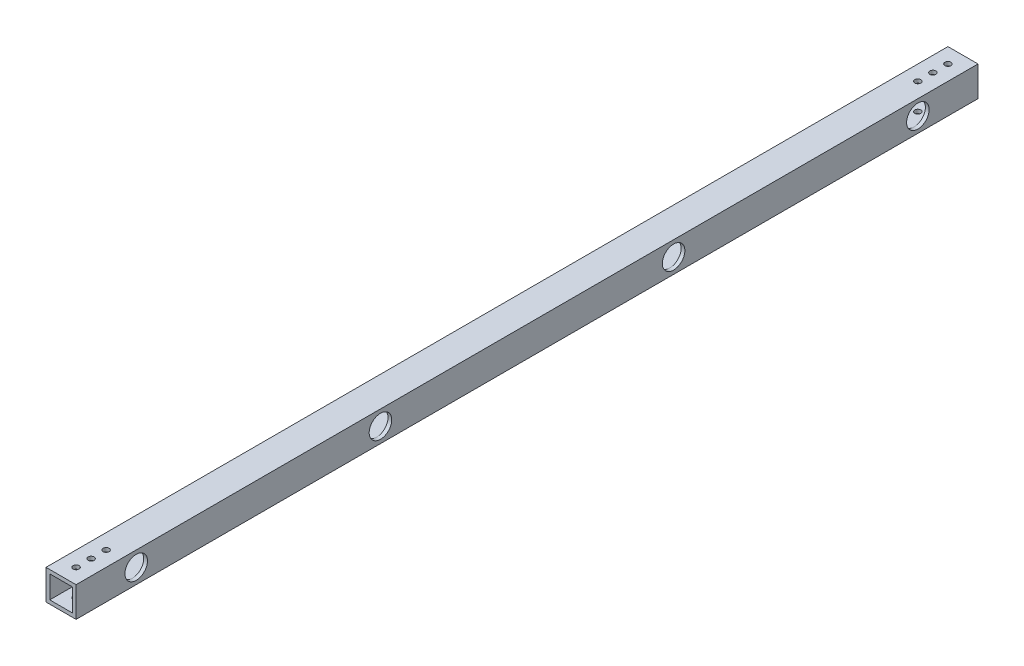
ISO-10303-21;
HEADER;
FILE_DESCRIPTION(('STEP AP214'),'2;1');
FILE_NAME('part.step','',(''),(''),'','','');
FILE_SCHEMA(('AUTOMOTIVE_DESIGN { 1 0 10303 214 1 1 1 1 }'));
ENDSEC;
DATA;
#1=APPLICATION_CONTEXT('core data for automotive mechanical design processes');
#2=APPLICATION_PROTOCOL_DEFINITION('international standard','automotive_design',2000,#1);
#3=PRODUCT_CONTEXT('',#1,'mechanical');
#4=PRODUCT('Part','Part','',(#3));
#5=PRODUCT_RELATED_PRODUCT_CATEGORY('part','',(#4));
#6=PRODUCT_DEFINITION_FORMATION('','',#4);
#7=PRODUCT_DEFINITION_CONTEXT('part definition',#1,'design');
#8=PRODUCT_DEFINITION('design','',#6,#7);
#9=PRODUCT_DEFINITION_SHAPE('','',#8);
#10=(LENGTH_UNIT() NAMED_UNIT(*) SI_UNIT(.MILLI.,.METRE.));
#11=(NAMED_UNIT(*) PLANE_ANGLE_UNIT() SI_UNIT($,.RADIAN.));
#12=(NAMED_UNIT(*) SI_UNIT($,.STERADIAN.) SOLID_ANGLE_UNIT());
#13=UNCERTAINTY_MEASURE_WITH_UNIT(LENGTH_MEASURE(1.E-05),#10,'distance_accuracy_value','');
#14=(GEOMETRIC_REPRESENTATION_CONTEXT(3) GLOBAL_UNCERTAINTY_ASSIGNED_CONTEXT((#13)) GLOBAL_UNIT_ASSIGNED_CONTEXT((#10,
#11,#12)) REPRESENTATION_CONTEXT('',''));
#15=CARTESIAN_POINT('',(0.,0.,0.));
#16=DIRECTION('',(0.,0.,1.));
#17=DIRECTION('',(1.,0.,0.));
#18=AXIS2_PLACEMENT_3D('',#15,#16,#17);
#19=CARTESIAN_POINT('',(-22.225,22.225,762.));
#20=DIRECTION('',(1.,0.,0.));
#21=DIRECTION('',(0.,1.,0.));
#22=AXIS2_PLACEMENT_3D('',#19,#20,#21);
#23=PLANE('',#22);
#24=CARTESIAN_POINT('',(-22.225,12.7,50.8));
#25=DIRECTION('',(1.,0.,0.));
#26=DIRECTION('',(0.,1.,0.));
#27=AXIS2_PLACEMENT_3D('',#24,#25,#26);
#28=CIRCLE('',#27,9.52500000000001);
#29=CARTESIAN_POINT('',(-22.225,22.225,50.8));
#30=VERTEX_POINT('',#29);
#31=CARTESIAN_POINT('',(-22.225,3.175,50.8));
#32=VERTEX_POINT('',#31);
#33=EDGE_CURVE('E53',#30,#32,#28,.T.);
#34=ORIENTED_EDGE('',*,*,#33,.F.);
#35=DIRECTION('',(0.,0.,-1.));
#36=VECTOR('',#35,1.);
#37=CARTESIAN_POINT('',(-22.225,22.225,762.));
#38=LINE('',#37,#36);
#39=CARTESIAN_POINT('',(-22.225,22.225,257.175));
#40=VERTEX_POINT('',#39);
#41=EDGE_CURVE('E170',#40,#30,#38,.T.);
#42=ORIENTED_EDGE('',*,*,#41,.F.);
#43=CARTESIAN_POINT('',(-22.225,12.7,257.175));
#44=DIRECTION('',(1.,0.,0.));
#45=DIRECTION('',(0.,1.,0.));
#46=AXIS2_PLACEMENT_3D('',#43,#44,#45);
#47=CIRCLE('',#46,9.52500000000002);
#48=CARTESIAN_POINT('',(-22.225,3.175,257.175));
#49=VERTEX_POINT('',#48);
#50=EDGE_CURVE('E149',#49,#40,#47,.T.);
#51=ORIENTED_EDGE('',*,*,#50,.F.);
#52=DIRECTION('',(0.,0.,-1.));
#53=VECTOR('',#52,1.);
#54=CARTESIAN_POINT('',(-22.225,3.175,762.));
#55=LINE('',#54,#53);
#56=EDGE_CURVE('E311',#49,#32,#55,.T.);
#57=ORIENTED_EDGE('',*,*,#56,.T.);
#58=EDGE_LOOP('',(#34,#42,#51,#57));
#59=FACE_BOUND('',#58,.T.);
#60=ADVANCED_FACE('F37',(#59),#23,.T.);
#61=CARTESIAN_POINT('',(-22.225,12.7,711.2));
#62=DIRECTION('',(1.,0.,0.));
#63=DIRECTION('',(0.,1.,0.));
#64=AXIS2_PLACEMENT_3D('',#61,#62,#63);
#65=CIRCLE('',#64,9.52500000000002);
#66=CARTESIAN_POINT('',(-22.225,22.225,711.2));
#67=VERTEX_POINT('',#66);
#68=CARTESIAN_POINT('',(-22.225,3.175,711.2));
#69=VERTEX_POINT('',#68);
#70=EDGE_CURVE('E359',#67,#69,#65,.T.);
#71=ORIENTED_EDGE('',*,*,#70,.F.);
#72=CARTESIAN_POINT('',(-22.225,22.225,762.));
#73=VERTEX_POINT('',#72);
#74=EDGE_CURVE('E180',#73,#67,#38,.T.);
#75=ORIENTED_EDGE('',*,*,#74,.F.);
#76=DIRECTION('',(0.,-1.,0.));
#77=VECTOR('',#76,1.);
#78=CARTESIAN_POINT('',(-22.225,22.225,762.));
#79=LINE('',#78,#77);
#80=CARTESIAN_POINT('',(-22.225,3.175,762.));
#81=VERTEX_POINT('',#80);
#82=EDGE_CURVE('E281',#73,#81,#79,.T.);
#83=ORIENTED_EDGE('',*,*,#82,.T.);
#84=EDGE_CURVE('E196',#81,#69,#55,.T.);
#85=ORIENTED_EDGE('',*,*,#84,.T.);
#86=EDGE_LOOP('',(#71,#75,#83,#85));
#87=FACE_BOUND('',#86,.T.);
#88=ADVANCED_FACE('F357',(#87),#23,.T.);
#89=EDGE_CURVE('E362',#69,#67,#65,.T.);
#90=ORIENTED_EDGE('',*,*,#89,.F.);
#91=CARTESIAN_POINT('',(-22.225,3.175,504.825));
#92=VERTEX_POINT('',#91);
#93=EDGE_CURVE('E200',#69,#92,#55,.T.);
#94=ORIENTED_EDGE('',*,*,#93,.T.);
#95=CARTESIAN_POINT('',(-22.225,12.7,504.825));
#96=DIRECTION('',(1.,0.,0.));
#97=DIRECTION('',(0.,1.,0.));
#98=AXIS2_PLACEMENT_3D('',#95,#96,#97);
#99=CIRCLE('',#98,9.52500000000002);
#100=CARTESIAN_POINT('',(-22.225,22.225,504.825));
#101=VERTEX_POINT('',#100);
#102=EDGE_CURVE('E369',#101,#92,#99,.T.);
#103=ORIENTED_EDGE('',*,*,#102,.F.);
#104=EDGE_CURVE('E179',#67,#101,#38,.T.);
#105=ORIENTED_EDGE('',*,*,#104,.F.);
#106=EDGE_LOOP('',(#90,#94,#103,#105));
#107=FACE_BOUND('',#106,.T.);
#108=ADVANCED_FACE('F366',(#107),#23,.T.);
#109=EDGE_CURVE('E371',#92,#101,#99,.T.);
#110=ORIENTED_EDGE('',*,*,#109,.F.);
#111=EDGE_CURVE('E167',#92,#49,#55,.T.);
#112=ORIENTED_EDGE('',*,*,#111,.T.);
#113=EDGE_CURVE('E60',#40,#49,#47,.T.);
#114=ORIENTED_EDGE('',*,*,#113,.F.);
#115=EDGE_CURVE('E164',#101,#40,#38,.T.);
#116=ORIENTED_EDGE('',*,*,#115,.F.);
#117=EDGE_LOOP('',(#110,#112,#114,#116));
#118=FACE_BOUND('',#117,.T.);
#119=ADVANCED_FACE('F162',(#118),#23,.T.);
#120=CARTESIAN_POINT('',(-3.175,22.225,762.));
#121=DIRECTION('',(-1.,0.,0.));
#122=DIRECTION('',(0.,-1.,0.));
#123=AXIS2_PLACEMENT_3D('',#120,#121,#122);
#124=PLANE('',#123);
#125=CARTESIAN_POINT('',(-3.175,12.7,50.8));
#126=DIRECTION('',(-1.,0.,0.));
#127=DIRECTION('',(0.,-1.,0.));
#128=AXIS2_PLACEMENT_3D('',#125,#126,#127);
#129=CIRCLE('',#128,9.52500000000001);
#130=CARTESIAN_POINT('',(-3.175,3.175,50.8));
#131=VERTEX_POINT('',#130);
#132=CARTESIAN_POINT('',(-3.175,22.225,50.8));
#133=VERTEX_POINT('',#132);
#134=EDGE_CURVE('E377',#131,#133,#129,.T.);
#135=ORIENTED_EDGE('',*,*,#134,.F.);
#136=DIRECTION('',(0.,0.,-1.));
#137=VECTOR('',#136,1.);
#138=CARTESIAN_POINT('',(-3.175,3.175,762.));
#139=LINE('',#138,#137);
#140=CARTESIAN_POINT('',(-3.175,3.175,257.175));
#141=VERTEX_POINT('',#140);
#142=EDGE_CURVE('E318',#141,#131,#139,.T.);
#143=ORIENTED_EDGE('',*,*,#142,.F.);
#144=CARTESIAN_POINT('',(-3.175,12.7,257.175));
#145=DIRECTION('',(-1.,0.,0.));
#146=DIRECTION('',(0.,-1.,0.));
#147=AXIS2_PLACEMENT_3D('',#144,#145,#146);
#148=CIRCLE('',#147,9.52500000000002);
#149=CARTESIAN_POINT('',(-3.175,22.225,257.175));
#150=VERTEX_POINT('',#149);
#151=EDGE_CURVE('E729',#150,#141,#148,.T.);
#152=ORIENTED_EDGE('',*,*,#151,.F.);
#153=DIRECTION('',(0.,0.,-1.));
#154=VECTOR('',#153,1.);
#155=CARTESIAN_POINT('',(-3.175,22.225,762.));
#156=LINE('',#155,#154);
#157=EDGE_CURVE('E323',#150,#133,#156,.T.);
#158=ORIENTED_EDGE('',*,*,#157,.T.);
#159=EDGE_LOOP('',(#135,#143,#152,#158));
#160=FACE_BOUND('',#159,.T.);
#161=ADVANCED_FACE('F452',(#160),#124,.T.);
#162=CARTESIAN_POINT('',(-3.175,12.7,711.2));
#163=DIRECTION('',(-1.,0.,0.));
#164=DIRECTION('',(0.,-1.,0.));
#165=AXIS2_PLACEMENT_3D('',#162,#163,#164);
#166=CIRCLE('',#165,9.52500000000002);
#167=CARTESIAN_POINT('',(-3.175,3.175,711.2));
#168=VERTEX_POINT('',#167);
#169=CARTESIAN_POINT('',(-3.175,22.225,711.2));
#170=VERTEX_POINT('',#169);
#171=EDGE_CURVE('E347',#168,#170,#166,.T.);
#172=ORIENTED_EDGE('',*,*,#171,.F.);
#173=CARTESIAN_POINT('',(-3.175,3.175,762.));
#174=VERTEX_POINT('',#173);
#175=EDGE_CURVE('E191',#174,#168,#139,.T.);
#176=ORIENTED_EDGE('',*,*,#175,.F.);
#177=DIRECTION('',(0.,1.,0.));
#178=VECTOR('',#177,1.);
#179=CARTESIAN_POINT('',(-3.175,22.225,762.));
#180=LINE('',#179,#178);
#181=CARTESIAN_POINT('',(-3.175,22.225,762.));
#182=VERTEX_POINT('',#181);
#183=EDGE_CURVE('E285',#174,#182,#180,.T.);
#184=ORIENTED_EDGE('',*,*,#183,.T.);
#185=EDGE_CURVE('E186',#182,#170,#156,.T.);
#186=ORIENTED_EDGE('',*,*,#185,.T.);
#187=EDGE_LOOP('',(#172,#176,#184,#186));
#188=FACE_BOUND('',#187,.T.);
#189=ADVANCED_FACE('F345',(#188),#124,.T.);
#190=EDGE_CURVE('E342',#170,#168,#166,.T.);
#191=ORIENTED_EDGE('',*,*,#190,.F.);
#192=CARTESIAN_POINT('',(-3.175,22.225,504.825));
#193=VERTEX_POINT('',#192);
#194=EDGE_CURVE('E190',#170,#193,#156,.T.);
#195=ORIENTED_EDGE('',*,*,#194,.T.);
#196=CARTESIAN_POINT('',(-3.175,12.7,504.825));
#197=DIRECTION('',(-1.,0.,0.));
#198=DIRECTION('',(0.,-1.,0.));
#199=AXIS2_PLACEMENT_3D('',#196,#197,#198);
#200=CIRCLE('',#199,9.52500000000002);
#201=CARTESIAN_POINT('',(-3.175,3.175,504.825));
#202=VERTEX_POINT('',#201);
#203=EDGE_CURVE('E340',#202,#193,#200,.T.);
#204=ORIENTED_EDGE('',*,*,#203,.F.);
#205=EDGE_CURVE('E195',#168,#202,#139,.T.);
#206=ORIENTED_EDGE('',*,*,#205,.F.);
#207=EDGE_LOOP('',(#191,#195,#204,#206));
#208=FACE_BOUND('',#207,.T.);
#209=ADVANCED_FACE('F338',(#208),#124,.T.);
#210=EDGE_CURVE('E168',#193,#202,#200,.T.);
#211=ORIENTED_EDGE('',*,*,#210,.F.);
#212=EDGE_CURVE('E324',#193,#150,#156,.T.);
#213=ORIENTED_EDGE('',*,*,#212,.T.);
#214=EDGE_CURVE('E156',#141,#150,#148,.T.);
#215=ORIENTED_EDGE('',*,*,#214,.F.);
#216=EDGE_CURVE('E750',#202,#141,#139,.T.);
#217=ORIENTED_EDGE('',*,*,#216,.F.);
#218=EDGE_LOOP('',(#211,#213,#215,#217));
#219=FACE_BOUND('',#218,.T.);
#220=ADVANCED_FACE('F436',(#219),#124,.T.);
#221=CARTESIAN_POINT('',(0.,0.,762.));
#222=DIRECTION('',(0.,1.,0.));
#223=DIRECTION('',(-1.,0.,0.));
#224=AXIS2_PLACEMENT_3D('',#221,#222,#223);
#225=PLANE('',#224);
#226=DIRECTION('',(1.,0.,0.));
#227=VECTOR('',#226,1.);
#228=CARTESIAN_POINT('',(0.,0.,0.));
#229=LINE('',#228,#227);
#230=CARTESIAN_POINT('',(-25.4,0.,0.));
#231=VERTEX_POINT('',#230);
#232=CARTESIAN_POINT('',(0.,0.,0.));
#233=VERTEX_POINT('',#232);
#234=EDGE_CURVE('E205',#231,#233,#229,.T.);
#235=ORIENTED_EDGE('',*,*,#234,.T.);
#236=DIRECTION('',(0.,0.,-1.));
#237=VECTOR('',#236,1.);
#238=CARTESIAN_POINT('',(0.,0.,762.));
#239=LINE('',#238,#237);
#240=CARTESIAN_POINT('',(0.,0.,762.));
#241=VERTEX_POINT('',#240);
#242=EDGE_CURVE('E211',#241,#233,#239,.T.);
#243=ORIENTED_EDGE('',*,*,#242,.F.);
#244=DIRECTION('',(1.,0.,0.));
#245=VECTOR('',#244,1.);
#246=CARTESIAN_POINT('',(0.,0.,762.));
#247=LINE('',#246,#245);
#248=CARTESIAN_POINT('',(-25.4,0.,762.));
#249=VERTEX_POINT('',#248);
#250=EDGE_CURVE('E209',#249,#241,#247,.T.);
#251=ORIENTED_EDGE('',*,*,#250,.F.);
#252=DIRECTION('',(0.,0.,-1.));
#253=VECTOR('',#252,1.);
#254=CARTESIAN_POINT('',(-25.4,0.,762.));
#255=LINE('',#254,#253);
#256=EDGE_CURVE('E221',#249,#231,#255,.T.);
#257=ORIENTED_EDGE('',*,*,#256,.T.);
#258=EDGE_LOOP('',(#235,#243,#251,#257));
#259=FACE_BOUND('',#258,.T.);
#260=CARTESIAN_POINT('',(-12.7,0.,12.7));
#261=DIRECTION('',(0.,1.,0.));
#262=DIRECTION('',(-1.,0.,0.));
#263=AXIS2_PLACEMENT_3D('',#260,#261,#262);
#264=CIRCLE('',#263,2.55269999999999);
#265=CARTESIAN_POINT('',(-15.2527,0.,12.7));
#266=VERTEX_POINT('',#265);
#267=EDGE_CURVE('E230',#266,#266,#264,.F.);
#268=ORIENTED_EDGE('',*,*,#267,.F.);
#269=EDGE_LOOP('',(#268));
#270=FACE_BOUND('',#269,.T.);
#271=CARTESIAN_POINT('',(-12.7,0.,25.4));
#272=DIRECTION('',(0.,1.,0.));
#273=DIRECTION('',(-1.,0.,0.));
#274=AXIS2_PLACEMENT_3D('',#271,#272,#273);
#275=CIRCLE('',#274,2.55269999999999);
#276=CARTESIAN_POINT('',(-15.2527,0.,25.4));
#277=VERTEX_POINT('',#276);
#278=EDGE_CURVE('E235',#277,#277,#275,.F.);
#279=ORIENTED_EDGE('',*,*,#278,.F.);
#280=EDGE_LOOP('',(#279));
#281=FACE_BOUND('',#280,.T.);
#282=CARTESIAN_POINT('',(-12.7,0.,38.1));
#283=DIRECTION('',(0.,1.,0.));
#284=DIRECTION('',(-1.,0.,0.));
#285=AXIS2_PLACEMENT_3D('',#282,#283,#284);
#286=CIRCLE('',#285,2.55269999999999);
#287=CARTESIAN_POINT('',(-15.2527,0.,38.1));
#288=VERTEX_POINT('',#287);
#289=EDGE_CURVE('E239',#288,#288,#286,.F.);
#290=ORIENTED_EDGE('',*,*,#289,.F.);
#291=EDGE_LOOP('',(#290));
#292=FACE_BOUND('',#291,.T.);
#293=CARTESIAN_POINT('',(-12.7,0.,723.9));
#294=DIRECTION('',(0.,1.,0.));
#295=DIRECTION('',(-1.,0.,0.));
#296=AXIS2_PLACEMENT_3D('',#293,#294,#295);
#297=CIRCLE('',#296,2.55269999999999);
#298=CARTESIAN_POINT('',(-15.2527,0.,723.9));
#299=VERTEX_POINT('',#298);
#300=EDGE_CURVE('E243',#299,#299,#297,.F.);
#301=ORIENTED_EDGE('',*,*,#300,.F.);
#302=EDGE_LOOP('',(#301));
#303=FACE_BOUND('',#302,.T.);
#304=CARTESIAN_POINT('',(-12.7,0.,736.6));
#305=DIRECTION('',(0.,1.,0.));
#306=DIRECTION('',(-1.,0.,0.));
#307=AXIS2_PLACEMENT_3D('',#304,#305,#306);
#308=CIRCLE('',#307,2.55269999999999);
#309=CARTESIAN_POINT('',(-15.2527,0.,736.6));
#310=VERTEX_POINT('',#309);
#311=EDGE_CURVE('E392',#310,#310,#308,.F.);
#312=ORIENTED_EDGE('',*,*,#311,.F.);
#313=EDGE_LOOP('',(#312));
#314=FACE_BOUND('',#313,.T.);
#315=CARTESIAN_POINT('',(-12.7,0.,749.3));
#316=DIRECTION('',(0.,1.,0.));
#317=DIRECTION('',(-1.,0.,0.));
#318=AXIS2_PLACEMENT_3D('',#315,#316,#317);
#319=CIRCLE('',#318,2.55269999999999);
#320=CARTESIAN_POINT('',(-15.2527,0.,749.3));
#321=VERTEX_POINT('',#320);
#322=EDGE_CURVE('E379',#321,#321,#319,.F.);
#323=ORIENTED_EDGE('',*,*,#322,.F.);
#324=EDGE_LOOP('',(#323));
#325=FACE_BOUND('',#324,.T.);
#326=ADVANCED_FACE('F423',(#259,#270,#281,#292,#303,#314,#325),#225,.F.);
#327=CARTESIAN_POINT('',(0.,0.,762.));
#328=DIRECTION('',(0.,0.,1.));
#329=DIRECTION('',(1.,0.,0.));
#330=AXIS2_PLACEMENT_3D('',#327,#328,#329);
#331=PLANE('',#330);
#332=DIRECTION('',(0.,1.,0.));
#333=VECTOR('',#332,1.);
#334=CARTESIAN_POINT('',(0.,0.,762.));
#335=LINE('',#334,#333);
#336=CARTESIAN_POINT('',(0.,25.4,762.));
#337=VERTEX_POINT('',#336);
#338=EDGE_CURVE('E201',#241,#337,#335,.T.);
#339=ORIENTED_EDGE('',*,*,#338,.T.);
#340=DIRECTION('',(-1.,0.,0.));
#341=VECTOR('',#340,1.);
#342=CARTESIAN_POINT('',(0.,25.4,762.));
#343=LINE('',#342,#341);
#344=CARTESIAN_POINT('',(-25.4,25.4,762.));
#345=VERTEX_POINT('',#344);
#346=EDGE_CURVE('E204',#337,#345,#343,.T.);
#347=ORIENTED_EDGE('',*,*,#346,.T.);
#348=DIRECTION('',(0.,-1.,0.));
#349=VECTOR('',#348,1.);
#350=CARTESIAN_POINT('',(-25.4,0.,762.));
#351=LINE('',#350,#349);
#352=EDGE_CURVE('E207',#345,#249,#351,.T.);
#353=ORIENTED_EDGE('',*,*,#352,.T.);
#354=ORIENTED_EDGE('',*,*,#250,.T.);
#355=EDGE_LOOP('',(#339,#347,#353,#354));
#356=FACE_BOUND('',#355,.T.);
#357=DIRECTION('',(1.,0.,0.));
#358=VECTOR('',#357,1.);
#359=CARTESIAN_POINT('',(-22.225,3.175,762.));
#360=LINE('',#359,#358);
#361=EDGE_CURVE('E283',#81,#174,#360,.T.);
#362=ORIENTED_EDGE('',*,*,#361,.F.);
#363=ORIENTED_EDGE('',*,*,#82,.F.);
#364=DIRECTION('',(-1.,0.,0.));
#365=VECTOR('',#364,1.);
#366=CARTESIAN_POINT('',(-22.225,22.225,762.));
#367=LINE('',#366,#365);
#368=EDGE_CURVE('E288',#182,#73,#367,.T.);
#369=ORIENTED_EDGE('',*,*,#368,.F.);
#370=ORIENTED_EDGE('',*,*,#183,.F.);
#371=EDGE_LOOP('',(#362,#363,#369,#370));
#372=FACE_BOUND('',#371,.T.);
#373=ADVANCED_FACE('F353',(#356,#372),#331,.T.);
#374=CARTESIAN_POINT('',(0.,0.,0.));
#375=DIRECTION('',(0.,0.,1.));
#376=DIRECTION('',(1.,0.,0.));
#377=AXIS2_PLACEMENT_3D('',#374,#375,#376);
#378=PLANE('',#377);
#379=DIRECTION('',(0.,1.,0.));
#380=VECTOR('',#379,1.);
#381=CARTESIAN_POINT('',(0.,0.,0.));
#382=LINE('',#381,#380);
#383=CARTESIAN_POINT('',(0.,25.4,0.));
#384=VERTEX_POINT('',#383);
#385=EDGE_CURVE('E199',#233,#384,#382,.T.);
#386=ORIENTED_EDGE('',*,*,#385,.F.);
#387=ORIENTED_EDGE('',*,*,#234,.F.);
#388=DIRECTION('',(0.,-1.,0.));
#389=VECTOR('',#388,1.);
#390=CARTESIAN_POINT('',(-25.4,0.,0.));
#391=LINE('',#390,#389);
#392=CARTESIAN_POINT('',(-25.4,25.4,0.));
#393=VERTEX_POINT('',#392);
#394=EDGE_CURVE('E216',#393,#231,#391,.T.);
#395=ORIENTED_EDGE('',*,*,#394,.F.);
#396=DIRECTION('',(-1.,0.,0.));
#397=VECTOR('',#396,1.);
#398=CARTESIAN_POINT('',(0.,25.4,0.));
#399=LINE('',#398,#397);
#400=EDGE_CURVE('E214',#384,#393,#399,.T.);
#401=ORIENTED_EDGE('',*,*,#400,.F.);
#402=EDGE_LOOP('',(#386,#387,#395,#401));
#403=FACE_BOUND('',#402,.T.);
#404=DIRECTION('',(0.,-1.,0.));
#405=VECTOR('',#404,1.);
#406=CARTESIAN_POINT('',(-22.225,22.225,0.));
#407=LINE('',#406,#405);
#408=CARTESIAN_POINT('',(-22.225,22.225,0.));
#409=VERTEX_POINT('',#408);
#410=CARTESIAN_POINT('',(-22.225,3.175,0.));
#411=VERTEX_POINT('',#410);
#412=EDGE_CURVE('E280',#409,#411,#407,.T.);
#413=ORIENTED_EDGE('',*,*,#412,.T.);
#414=DIRECTION('',(1.,0.,0.));
#415=VECTOR('',#414,1.);
#416=CARTESIAN_POINT('',(-22.225,3.175,0.));
#417=LINE('',#416,#415);
#418=CARTESIAN_POINT('',(-3.175,3.175,0.));
#419=VERTEX_POINT('',#418);
#420=EDGE_CURVE('E292',#411,#419,#417,.T.);
#421=ORIENTED_EDGE('',*,*,#420,.T.);
#422=DIRECTION('',(0.,1.,0.));
#423=VECTOR('',#422,1.);
#424=CARTESIAN_POINT('',(-3.175,22.225,0.));
#425=LINE('',#424,#423);
#426=CARTESIAN_POINT('',(-3.175,22.225,0.));
#427=VERTEX_POINT('',#426);
#428=EDGE_CURVE('E294',#419,#427,#425,.T.);
#429=ORIENTED_EDGE('',*,*,#428,.T.);
#430=DIRECTION('',(-1.,0.,0.));
#431=VECTOR('',#430,1.);
#432=CARTESIAN_POINT('',(-22.225,22.225,0.));
#433=LINE('',#432,#431);
#434=EDGE_CURVE('E184',#427,#409,#433,.T.);
#435=ORIENTED_EDGE('',*,*,#434,.T.);
#436=EDGE_LOOP('',(#413,#421,#429,#435));
#437=FACE_BOUND('',#436,.T.);
#438=ADVANCED_FACE('F300',(#403,#437),#378,.F.);
#439=CARTESIAN_POINT('',(0.,0.,762.));
#440=DIRECTION('',(-1.,0.,0.));
#441=DIRECTION('',(0.,-1.,0.));
#442=AXIS2_PLACEMENT_3D('',#439,#440,#441);
#443=PLANE('',#442);
#444=CARTESIAN_POINT('',(0.,12.7,50.8));
#445=DIRECTION('',(-1.,0.,0.));
#446=DIRECTION('',(0.,-1.,0.));
#447=AXIS2_PLACEMENT_3D('',#444,#445,#446);
#448=CIRCLE('',#447,9.52500000000001);
#449=CARTESIAN_POINT('',(0.,3.17499999999999,50.8));
#450=VERTEX_POINT('',#449);
#451=EDGE_CURVE('E725',#450,#450,#448,.F.);
#452=ORIENTED_EDGE('',*,*,#451,.F.);
#453=EDGE_LOOP('',(#452));
#454=FACE_BOUND('',#453,.T.);
#455=CARTESIAN_POINT('',(0.,12.7,711.2));
#456=DIRECTION('',(-1.,0.,0.));
#457=DIRECTION('',(0.,-1.,0.));
#458=AXIS2_PLACEMENT_3D('',#455,#456,#457);
#459=CIRCLE('',#458,9.52500000000002);
#460=CARTESIAN_POINT('',(0.,3.17499999999997,711.2));
#461=VERTEX_POINT('',#460);
#462=EDGE_CURVE('E726',#461,#461,#459,.F.);
#463=ORIENTED_EDGE('',*,*,#462,.F.);
#464=EDGE_LOOP('',(#463));
#465=FACE_BOUND('',#464,.T.);
#466=CARTESIAN_POINT('',(0.,12.7,504.825));
#467=DIRECTION('',(-1.,0.,0.));
#468=DIRECTION('',(0.,-1.,0.));
#469=AXIS2_PLACEMENT_3D('',#466,#467,#468);
#470=CIRCLE('',#469,9.52500000000002);
#471=CARTESIAN_POINT('',(0.,3.17499999999997,504.825));
#472=VERTEX_POINT('',#471);
#473=EDGE_CURVE('E736',#472,#472,#470,.F.);
#474=ORIENTED_EDGE('',*,*,#473,.F.);
#475=EDGE_LOOP('',(#474));
#476=FACE_BOUND('',#475,.T.);
#477=CARTESIAN_POINT('',(0.,12.7,257.175));
#478=DIRECTION('',(-1.,0.,0.));
#479=DIRECTION('',(0.,-1.,0.));
#480=AXIS2_PLACEMENT_3D('',#477,#478,#479);
#481=CIRCLE('',#480,9.52500000000002);
#482=CARTESIAN_POINT('',(0.,3.17499999999997,257.175));
#483=VERTEX_POINT('',#482);
#484=EDGE_CURVE('E741',#483,#483,#481,.F.);
#485=ORIENTED_EDGE('',*,*,#484,.F.);
#486=EDGE_LOOP('',(#485));
#487=FACE_BOUND('',#486,.T.);
#488=ORIENTED_EDGE('',*,*,#385,.T.);
#489=DIRECTION('',(0.,0.,-1.));
#490=VECTOR('',#489,1.);
#491=CARTESIAN_POINT('',(0.,25.4,762.));
#492=LINE('',#491,#490);
#493=EDGE_CURVE('E11',#337,#384,#492,.T.);
#494=ORIENTED_EDGE('',*,*,#493,.F.);
#495=ORIENTED_EDGE('',*,*,#338,.F.);
#496=ORIENTED_EDGE('',*,*,#242,.T.);
#497=EDGE_LOOP('',(#488,#494,#495,#496));
#498=FACE_BOUND('',#497,.T.);
#499=ADVANCED_FACE('F39',(#454,#465,#476,#487,#498),#443,.F.);
#500=CARTESIAN_POINT('',(0.,25.4,762.));
#501=DIRECTION('',(0.,-1.,0.));
#502=DIRECTION('',(1.,0.,0.));
#503=AXIS2_PLACEMENT_3D('',#500,#501,#502);
#504=PLANE('',#503);
#505=CARTESIAN_POINT('',(-12.7,25.4,749.3));
#506=DIRECTION('',(0.,1.,0.));
#507=DIRECTION('',(0.,0.,1.));
#508=AXIS2_PLACEMENT_3D('',#505,#506,#507);
#509=CIRCLE('',#508,2.55269999999999);
#510=CARTESIAN_POINT('',(-12.7,25.4,751.8527));
#511=VERTEX_POINT('',#510);
#512=EDGE_CURVE('E383',#511,#511,#509,.T.);
#513=ORIENTED_EDGE('',*,*,#512,.F.);
#514=EDGE_LOOP('',(#513));
#515=FACE_BOUND('',#514,.T.);
#516=CARTESIAN_POINT('',(-12.7,25.4,736.6));
#517=DIRECTION('',(0.,1.,0.));
#518=DIRECTION('',(0.,0.,1.));
#519=AXIS2_PLACEMENT_3D('',#516,#517,#518);
#520=CIRCLE('',#519,2.55269999999999);
#521=CARTESIAN_POINT('',(-12.7,25.4,739.1527));
#522=VERTEX_POINT('',#521);
#523=EDGE_CURVE('E391',#522,#522,#520,.T.);
#524=ORIENTED_EDGE('',*,*,#523,.F.);
#525=EDGE_LOOP('',(#524));
#526=FACE_BOUND('',#525,.T.);
#527=CARTESIAN_POINT('',(-12.7,25.4,723.9));
#528=DIRECTION('',(0.,1.,0.));
#529=DIRECTION('',(0.,0.,1.));
#530=AXIS2_PLACEMENT_3D('',#527,#528,#529);
#531=CIRCLE('',#530,2.55269999999999);
#532=CARTESIAN_POINT('',(-12.7,25.4,726.4527));
#533=VERTEX_POINT('',#532);
#534=EDGE_CURVE('E250',#533,#533,#531,.T.);
#535=ORIENTED_EDGE('',*,*,#534,.F.);
#536=EDGE_LOOP('',(#535));
#537=FACE_BOUND('',#536,.T.);
#538=CARTESIAN_POINT('',(-12.7,25.4,38.1));
#539=DIRECTION('',(0.,1.,0.));
#540=DIRECTION('',(0.,0.,1.));
#541=AXIS2_PLACEMENT_3D('',#538,#539,#540);
#542=CIRCLE('',#541,2.55269999999999);
#543=CARTESIAN_POINT('',(-12.7,25.4,40.6527));
#544=VERTEX_POINT('',#543);
#545=EDGE_CURVE('E247',#544,#544,#542,.T.);
#546=ORIENTED_EDGE('',*,*,#545,.F.);
#547=EDGE_LOOP('',(#546));
#548=FACE_BOUND('',#547,.T.);
#549=CARTESIAN_POINT('',(-12.7,25.4,25.4));
#550=DIRECTION('',(0.,1.,0.));
#551=DIRECTION('',(0.,0.,1.));
#552=AXIS2_PLACEMENT_3D('',#549,#550,#551);
#553=CIRCLE('',#552,2.55269999999999);
#554=CARTESIAN_POINT('',(-12.7,25.4,27.9527));
#555=VERTEX_POINT('',#554);
#556=EDGE_CURVE('E266',#555,#555,#553,.T.);
#557=ORIENTED_EDGE('',*,*,#556,.F.);
#558=EDGE_LOOP('',(#557));
#559=FACE_BOUND('',#558,.T.);
#560=CARTESIAN_POINT('',(-12.7,25.4,12.7));
#561=DIRECTION('',(0.,1.,0.));
#562=DIRECTION('',(0.,0.,1.));
#563=AXIS2_PLACEMENT_3D('',#560,#561,#562);
#564=CIRCLE('',#563,2.55269999999999);
#565=CARTESIAN_POINT('',(-12.7,25.4,15.2527));
#566=VERTEX_POINT('',#565);
#567=EDGE_CURVE('E273',#566,#566,#564,.T.);
#568=ORIENTED_EDGE('',*,*,#567,.F.);
#569=EDGE_LOOP('',(#568));
#570=FACE_BOUND('',#569,.T.);
#571=ORIENTED_EDGE('',*,*,#400,.T.);
#572=DIRECTION('',(0.,0.,-1.));
#573=VECTOR('',#572,1.);
#574=CARTESIAN_POINT('',(-25.4,25.4,762.));
#575=LINE('',#574,#573);
#576=EDGE_CURVE('E46',#345,#393,#575,.T.);
#577=ORIENTED_EDGE('',*,*,#576,.F.);
#578=ORIENTED_EDGE('',*,*,#346,.F.);
#579=ORIENTED_EDGE('',*,*,#493,.T.);
#580=EDGE_LOOP('',(#571,#577,#578,#579));
#581=FACE_BOUND('',#580,.T.);
#582=ADVANCED_FACE('F399',(#515,#526,#537,#548,#559,#570,#581),#504,.F.);
#583=CARTESIAN_POINT('',(-25.4,0.,762.));
#584=DIRECTION('',(1.,0.,0.));
#585=DIRECTION('',(0.,0.,-1.));
#586=AXIS2_PLACEMENT_3D('',#583,#584,#585);
#587=PLANE('',#586);
#588=CARTESIAN_POINT('',(-25.4,12.7,50.8));
#589=DIRECTION('',(-1.,0.,0.));
#590=DIRECTION('',(0.,0.,1.));
#591=AXIS2_PLACEMENT_3D('',#588,#589,#590);
#592=CIRCLE('',#591,9.52500000000001);
#593=CARTESIAN_POINT('',(-25.4,12.7,60.325));
#594=VERTEX_POINT('',#593);
#595=EDGE_CURVE('E724',#594,#594,#592,.T.);
#596=ORIENTED_EDGE('',*,*,#595,.F.);
#597=EDGE_LOOP('',(#596));
#598=FACE_BOUND('',#597,.T.);
#599=CARTESIAN_POINT('',(-25.4,12.7,711.2));
#600=DIRECTION('',(-1.,0.,0.));
#601=DIRECTION('',(0.,0.,1.));
#602=AXIS2_PLACEMENT_3D('',#599,#600,#601);
#603=CIRCLE('',#602,9.52500000000002);
#604=CARTESIAN_POINT('',(-25.4,12.7,720.725));
#605=VERTEX_POINT('',#604);
#606=EDGE_CURVE('E732',#605,#605,#603,.T.);
#607=ORIENTED_EDGE('',*,*,#606,.F.);
#608=EDGE_LOOP('',(#607));
#609=FACE_BOUND('',#608,.T.);
#610=CARTESIAN_POINT('',(-25.4,12.7,504.825));
#611=DIRECTION('',(-1.,0.,0.));
#612=DIRECTION('',(0.,0.,1.));
#613=AXIS2_PLACEMENT_3D('',#610,#611,#612);
#614=CIRCLE('',#613,9.52500000000002);
#615=CARTESIAN_POINT('',(-25.4,12.7,514.35));
#616=VERTEX_POINT('',#615);
#617=EDGE_CURVE('E738',#616,#616,#614,.T.);
#618=ORIENTED_EDGE('',*,*,#617,.F.);
#619=EDGE_LOOP('',(#618));
#620=FACE_BOUND('',#619,.T.);
#621=CARTESIAN_POINT('',(-25.4,12.7,257.175));
#622=DIRECTION('',(-1.,0.,0.));
#623=DIRECTION('',(0.,0.,1.));
#624=AXIS2_PLACEMENT_3D('',#621,#622,#623);
#625=CIRCLE('',#624,9.52500000000002);
#626=CARTESIAN_POINT('',(-25.4,12.7,266.7));
#627=VERTEX_POINT('',#626);
#628=EDGE_CURVE('E744',#627,#627,#625,.T.);
#629=ORIENTED_EDGE('',*,*,#628,.F.);
#630=EDGE_LOOP('',(#629));
#631=FACE_BOUND('',#630,.T.);
#632=ORIENTED_EDGE('',*,*,#394,.T.);
#633=ORIENTED_EDGE('',*,*,#256,.F.);
#634=ORIENTED_EDGE('',*,*,#352,.F.);
#635=ORIENTED_EDGE('',*,*,#576,.T.);
#636=EDGE_LOOP('',(#632,#633,#634,#635));
#637=FACE_BOUND('',#636,.T.);
#638=ADVANCED_FACE('F402',(#598,#609,#620,#631,#637),#587,.F.);
#639=EDGE_CURVE('E309',#32,#30,#28,.T.);
#640=ORIENTED_EDGE('',*,*,#639,.F.);
#641=EDGE_CURVE('E194',#32,#411,#55,.T.);
#642=ORIENTED_EDGE('',*,*,#641,.T.);
#643=ORIENTED_EDGE('',*,*,#412,.F.);
#644=EDGE_CURVE('E173',#30,#409,#38,.T.);
#645=ORIENTED_EDGE('',*,*,#644,.F.);
#646=EDGE_LOOP('',(#640,#642,#643,#645));
#647=FACE_BOUND('',#646,.T.);
#648=ADVANCED_FACE('F306',(#647),#23,.T.);
#649=CARTESIAN_POINT('',(-22.225,3.175,762.));
#650=DIRECTION('',(0.,1.,0.));
#651=DIRECTION('',(0.,0.,1.));
#652=AXIS2_PLACEMENT_3D('',#649,#650,#651);
#653=PLANE('',#652);
#654=ORIENTED_EDGE('',*,*,#641,.F.);
#655=ORIENTED_EDGE('',*,*,#56,.F.);
#656=ORIENTED_EDGE('',*,*,#111,.F.);
#657=ORIENTED_EDGE('',*,*,#93,.F.);
#658=ORIENTED_EDGE('',*,*,#84,.F.);
#659=ORIENTED_EDGE('',*,*,#361,.T.);
#660=ORIENTED_EDGE('',*,*,#175,.T.);
#661=ORIENTED_EDGE('',*,*,#205,.T.);
#662=ORIENTED_EDGE('',*,*,#216,.T.);
#663=ORIENTED_EDGE('',*,*,#142,.T.);
#664=EDGE_CURVE('E189',#131,#419,#139,.T.);
#665=ORIENTED_EDGE('',*,*,#664,.T.);
#666=ORIENTED_EDGE('',*,*,#420,.F.);
#667=EDGE_LOOP('',(#654,#655,#656,#657,#658,#659,#660,#661,#662,#663,#665,#666));
#668=FACE_BOUND('',#667,.T.);
#669=CARTESIAN_POINT('',(-12.7,3.175,38.1));
#670=DIRECTION('',(0.,1.,0.));
#671=DIRECTION('',(0.,0.,1.));
#672=AXIS2_PLACEMENT_3D('',#669,#670,#671);
#673=CIRCLE('',#672,2.55269999999999);
#674=CARTESIAN_POINT('',(-12.7,3.175,40.6527));
#675=VERTEX_POINT('',#674);
#676=EDGE_CURVE('E238',#675,#675,#673,.T.);
#677=ORIENTED_EDGE('',*,*,#676,.F.);
#678=EDGE_LOOP('',(#677));
#679=FACE_BOUND('',#678,.T.);
#680=CARTESIAN_POINT('',(-12.7,3.175,25.4));
#681=DIRECTION('',(0.,1.,0.));
#682=DIRECTION('',(0.,0.,1.));
#683=AXIS2_PLACEMENT_3D('',#680,#681,#682);
#684=CIRCLE('',#683,2.55269999999999);
#685=CARTESIAN_POINT('',(-12.7,3.175,27.9527));
#686=VERTEX_POINT('',#685);
#687=EDGE_CURVE('E234',#686,#686,#684,.T.);
#688=ORIENTED_EDGE('',*,*,#687,.F.);
#689=EDGE_LOOP('',(#688));
#690=FACE_BOUND('',#689,.T.);
#691=CARTESIAN_POINT('',(-12.7,3.175,12.7));
#692=DIRECTION('',(0.,1.,0.));
#693=DIRECTION('',(0.,0.,1.));
#694=AXIS2_PLACEMENT_3D('',#691,#692,#693);
#695=CIRCLE('',#694,2.55269999999999);
#696=CARTESIAN_POINT('',(-12.7,3.175,15.2527));
#697=VERTEX_POINT('',#696);
#698=EDGE_CURVE('E229',#697,#697,#695,.T.);
#699=ORIENTED_EDGE('',*,*,#698,.F.);
#700=EDGE_LOOP('',(#699));
#701=FACE_BOUND('',#700,.T.);
#702=CARTESIAN_POINT('',(-12.7,3.175,723.9));
#703=DIRECTION('',(0.,1.,0.));
#704=DIRECTION('',(0.,0.,1.));
#705=AXIS2_PLACEMENT_3D('',#702,#703,#704);
#706=CIRCLE('',#705,2.55269999999999);
#707=CARTESIAN_POINT('',(-12.7,3.175,726.4527));
#708=VERTEX_POINT('',#707);
#709=EDGE_CURVE('E242',#708,#708,#706,.T.);
#710=ORIENTED_EDGE('',*,*,#709,.F.);
#711=EDGE_LOOP('',(#710));
#712=FACE_BOUND('',#711,.T.);
#713=CARTESIAN_POINT('',(-12.7,3.175,736.6));
#714=DIRECTION('',(0.,1.,0.));
#715=DIRECTION('',(0.,0.,1.));
#716=AXIS2_PLACEMENT_3D('',#713,#714,#715);
#717=CIRCLE('',#716,2.55269999999999);
#718=CARTESIAN_POINT('',(-12.7,3.175,739.1527));
#719=VERTEX_POINT('',#718);
#720=EDGE_CURVE('E255',#719,#719,#717,.T.);
#721=ORIENTED_EDGE('',*,*,#720,.F.);
#722=EDGE_LOOP('',(#721));
#723=FACE_BOUND('',#722,.T.);
#724=CARTESIAN_POINT('',(-12.7,3.175,749.3));
#725=DIRECTION('',(0.,1.,0.));
#726=DIRECTION('',(0.,0.,1.));
#727=AXIS2_PLACEMENT_3D('',#724,#725,#726);
#728=CIRCLE('',#727,2.55269999999999);
#729=CARTESIAN_POINT('',(-12.7,3.175,751.8527));
#730=VERTEX_POINT('',#729);
#731=EDGE_CURVE('E382',#730,#730,#728,.T.);
#732=ORIENTED_EDGE('',*,*,#731,.F.);
#733=EDGE_LOOP('',(#732));
#734=FACE_BOUND('',#733,.T.);
#735=ADVANCED_FACE('F312',(#668,#679,#690,#701,#712,#723,#734),#653,.T.);
#736=EDGE_CURVE('E322',#133,#131,#129,.T.);
#737=ORIENTED_EDGE('',*,*,#736,.F.);
#738=EDGE_CURVE('E183',#133,#427,#156,.T.);
#739=ORIENTED_EDGE('',*,*,#738,.T.);
#740=ORIENTED_EDGE('',*,*,#428,.F.);
#741=ORIENTED_EDGE('',*,*,#664,.F.);
#742=EDGE_LOOP('',(#737,#739,#740,#741));
#743=FACE_BOUND('',#742,.T.);
#744=ADVANCED_FACE('F321',(#743),#124,.T.);
#745=CARTESIAN_POINT('',(-22.225,22.225,762.));
#746=DIRECTION('',(0.,-1.,0.));
#747=DIRECTION('',(0.,0.,-1.));
#748=AXIS2_PLACEMENT_3D('',#745,#746,#747);
#749=PLANE('',#748);
#750=ORIENTED_EDGE('',*,*,#74,.T.);
#751=ORIENTED_EDGE('',*,*,#104,.T.);
#752=ORIENTED_EDGE('',*,*,#115,.T.);
#753=ORIENTED_EDGE('',*,*,#41,.T.);
#754=ORIENTED_EDGE('',*,*,#644,.T.);
#755=ORIENTED_EDGE('',*,*,#434,.F.);
#756=ORIENTED_EDGE('',*,*,#738,.F.);
#757=ORIENTED_EDGE('',*,*,#157,.F.);
#758=ORIENTED_EDGE('',*,*,#212,.F.);
#759=ORIENTED_EDGE('',*,*,#194,.F.);
#760=ORIENTED_EDGE('',*,*,#185,.F.);
#761=ORIENTED_EDGE('',*,*,#368,.T.);
#762=EDGE_LOOP('',(#750,#751,#752,#753,#754,#755,#756,#757,#758,#759,#760,#761));
#763=FACE_BOUND('',#762,.T.);
#764=CARTESIAN_POINT('',(-12.7,22.225,749.3));
#765=DIRECTION('',(0.,-1.,0.));
#766=DIRECTION('',(0.,0.,-1.));
#767=AXIS2_PLACEMENT_3D('',#764,#765,#766);
#768=CIRCLE('',#767,2.55269999999999);
#769=CARTESIAN_POINT('',(-12.7,22.225,746.7473));
#770=VERTEX_POINT('',#769);
#771=EDGE_CURVE('E388',#770,#770,#768,.T.);
#772=ORIENTED_EDGE('',*,*,#771,.F.);
#773=EDGE_LOOP('',(#772));
#774=FACE_BOUND('',#773,.T.);
#775=CARTESIAN_POINT('',(-12.7,22.225,736.6));
#776=DIRECTION('',(0.,-1.,0.));
#777=DIRECTION('',(0.,0.,-1.));
#778=AXIS2_PLACEMENT_3D('',#775,#776,#777);
#779=CIRCLE('',#778,2.55269999999999);
#780=CARTESIAN_POINT('',(-12.7,22.225,734.0473));
#781=VERTEX_POINT('',#780);
#782=EDGE_CURVE('E41',#781,#781,#779,.T.);
#783=ORIENTED_EDGE('',*,*,#782,.F.);
#784=EDGE_LOOP('',(#783));
#785=FACE_BOUND('',#784,.T.);
#786=CARTESIAN_POINT('',(-12.7,22.225,723.9));
#787=DIRECTION('',(0.,-1.,0.));
#788=DIRECTION('',(0.,0.,-1.));
#789=AXIS2_PLACEMENT_3D('',#786,#787,#788);
#790=CIRCLE('',#789,2.55269999999999);
#791=CARTESIAN_POINT('',(-12.7,22.225,721.3473));
#792=VERTEX_POINT('',#791);
#793=EDGE_CURVE('E240',#792,#792,#790,.T.);
#794=ORIENTED_EDGE('',*,*,#793,.F.);
#795=EDGE_LOOP('',(#794));
#796=FACE_BOUND('',#795,.T.);
#797=CARTESIAN_POINT('',(-12.7,22.225,12.7));
#798=DIRECTION('',(0.,-1.,0.));
#799=DIRECTION('',(0.,0.,-1.));
#800=AXIS2_PLACEMENT_3D('',#797,#798,#799);
#801=CIRCLE('',#800,2.55269999999999);
#802=CARTESIAN_POINT('',(-12.7,22.225,10.1473));
#803=VERTEX_POINT('',#802);
#804=EDGE_CURVE('E226',#803,#803,#801,.T.);
#805=ORIENTED_EDGE('',*,*,#804,.F.);
#806=EDGE_LOOP('',(#805));
#807=FACE_BOUND('',#806,.T.);
#808=CARTESIAN_POINT('',(-12.7,22.225,25.4));
#809=DIRECTION('',(0.,-1.,0.));
#810=DIRECTION('',(0.,0.,-1.));
#811=AXIS2_PLACEMENT_3D('',#808,#809,#810);
#812=CIRCLE('',#811,2.55269999999999);
#813=CARTESIAN_POINT('',(-12.7,22.225,22.8473));
#814=VERTEX_POINT('',#813);
#815=EDGE_CURVE('E231',#814,#814,#812,.T.);
#816=ORIENTED_EDGE('',*,*,#815,.F.);
#817=EDGE_LOOP('',(#816));
#818=FACE_BOUND('',#817,.T.);
#819=CARTESIAN_POINT('',(-12.7,22.225,38.1));
#820=DIRECTION('',(0.,-1.,0.));
#821=DIRECTION('',(0.,0.,-1.));
#822=AXIS2_PLACEMENT_3D('',#819,#820,#821);
#823=CIRCLE('',#822,2.55269999999999);
#824=CARTESIAN_POINT('',(-12.7,22.225,35.5473));
#825=VERTEX_POINT('',#824);
#826=EDGE_CURVE('E236',#825,#825,#823,.T.);
#827=ORIENTED_EDGE('',*,*,#826,.F.);
#828=EDGE_LOOP('',(#827));
#829=FACE_BOUND('',#828,.T.);
#830=ADVANCED_FACE('F176',(#763,#774,#785,#796,#807,#818,#829),#749,.T.);
#831=CARTESIAN_POINT('',(-12.7,25.4,12.7));
#832=DIRECTION('',(0.,1.,0.));
#833=DIRECTION('',(0.,0.,1.));
#834=AXIS2_PLACEMENT_3D('',#831,#832,#833);
#835=CYLINDRICAL_SURFACE('',#834,2.55269999999999);
#836=ORIENTED_EDGE('',*,*,#698,.T.);
#837=EDGE_LOOP('',(#836));
#838=FACE_BOUND('',#837,.T.);
#839=ORIENTED_EDGE('',*,*,#267,.T.);
#840=EDGE_LOOP('',(#839));
#841=FACE_BOUND('',#840,.T.);
#842=ADVANCED_FACE('F575',(#838,#841),#835,.F.);
#843=ORIENTED_EDGE('',*,*,#804,.T.);
#844=EDGE_LOOP('',(#843));
#845=FACE_BOUND('',#844,.T.);
#846=ORIENTED_EDGE('',*,*,#567,.T.);
#847=EDGE_LOOP('',(#846));
#848=FACE_BOUND('',#847,.T.);
#849=ADVANCED_FACE('F566',(#845,#848),#835,.F.);
#850=CARTESIAN_POINT('',(-12.7,25.4,25.4));
#851=DIRECTION('',(0.,1.,0.));
#852=DIRECTION('',(0.,0.,1.));
#853=AXIS2_PLACEMENT_3D('',#850,#851,#852);
#854=CYLINDRICAL_SURFACE('',#853,2.55269999999999);
#855=ORIENTED_EDGE('',*,*,#815,.T.);
#856=EDGE_LOOP('',(#855));
#857=FACE_BOUND('',#856,.T.);
#858=ORIENTED_EDGE('',*,*,#556,.T.);
#859=EDGE_LOOP('',(#858));
#860=FACE_BOUND('',#859,.T.);
#861=ADVANCED_FACE('F556',(#857,#860),#854,.F.);
#862=ORIENTED_EDGE('',*,*,#687,.T.);
#863=EDGE_LOOP('',(#862));
#864=FACE_BOUND('',#863,.T.);
#865=ORIENTED_EDGE('',*,*,#278,.T.);
#866=EDGE_LOOP('',(#865));
#867=FACE_BOUND('',#866,.T.);
#868=ADVANCED_FACE('F547',(#864,#867),#854,.F.);
#869=CARTESIAN_POINT('',(-12.7,25.4,38.1));
#870=DIRECTION('',(0.,1.,0.));
#871=DIRECTION('',(0.,0.,1.));
#872=AXIS2_PLACEMENT_3D('',#869,#870,#871);
#873=CYLINDRICAL_SURFACE('',#872,2.55269999999999);
#874=ORIENTED_EDGE('',*,*,#826,.T.);
#875=EDGE_LOOP('',(#874));
#876=FACE_BOUND('',#875,.T.);
#877=ORIENTED_EDGE('',*,*,#545,.T.);
#878=EDGE_LOOP('',(#877));
#879=FACE_BOUND('',#878,.T.);
#880=ADVANCED_FACE('F537',(#876,#879),#873,.F.);
#881=ORIENTED_EDGE('',*,*,#676,.T.);
#882=EDGE_LOOP('',(#881));
#883=FACE_BOUND('',#882,.T.);
#884=ORIENTED_EDGE('',*,*,#289,.T.);
#885=EDGE_LOOP('',(#884));
#886=FACE_BOUND('',#885,.T.);
#887=ADVANCED_FACE('F529',(#883,#886),#873,.F.);
#888=CARTESIAN_POINT('',(-12.7,25.4,723.9));
#889=DIRECTION('',(0.,1.,0.));
#890=DIRECTION('',(0.,0.,1.));
#891=AXIS2_PLACEMENT_3D('',#888,#889,#890);
#892=CYLINDRICAL_SURFACE('',#891,2.55269999999999);
#893=ORIENTED_EDGE('',*,*,#793,.T.);
#894=EDGE_LOOP('',(#893));
#895=FACE_BOUND('',#894,.T.);
#896=ORIENTED_EDGE('',*,*,#534,.T.);
#897=EDGE_LOOP('',(#896));
#898=FACE_BOUND('',#897,.T.);
#899=ADVANCED_FACE('F519',(#895,#898),#892,.F.);
#900=ORIENTED_EDGE('',*,*,#709,.T.);
#901=EDGE_LOOP('',(#900));
#902=FACE_BOUND('',#901,.T.);
#903=ORIENTED_EDGE('',*,*,#300,.T.);
#904=EDGE_LOOP('',(#903));
#905=FACE_BOUND('',#904,.T.);
#906=ADVANCED_FACE('F510',(#902,#905),#892,.F.);
#907=CARTESIAN_POINT('',(-12.7,25.4,736.6));
#908=DIRECTION('',(0.,1.,0.));
#909=DIRECTION('',(0.,0.,1.));
#910=AXIS2_PLACEMENT_3D('',#907,#908,#909);
#911=CYLINDRICAL_SURFACE('',#910,2.55269999999999);
#912=ORIENTED_EDGE('',*,*,#782,.T.);
#913=EDGE_LOOP('',(#912));
#914=FACE_BOUND('',#913,.T.);
#915=ORIENTED_EDGE('',*,*,#523,.T.);
#916=EDGE_LOOP('',(#915));
#917=FACE_BOUND('',#916,.T.);
#918=ADVANCED_FACE('F397',(#914,#917),#911,.F.);
#919=ORIENTED_EDGE('',*,*,#720,.T.);
#920=EDGE_LOOP('',(#919));
#921=FACE_BOUND('',#920,.T.);
#922=ORIENTED_EDGE('',*,*,#311,.T.);
#923=EDGE_LOOP('',(#922));
#924=FACE_BOUND('',#923,.T.);
#925=ADVANCED_FACE('F492',(#921,#924),#911,.F.);
#926=CARTESIAN_POINT('',(-12.7,25.4,749.3));
#927=DIRECTION('',(0.,1.,0.));
#928=DIRECTION('',(0.,0.,1.));
#929=AXIS2_PLACEMENT_3D('',#926,#927,#928);
#930=CYLINDRICAL_SURFACE('',#929,2.55269999999999);
#931=ORIENTED_EDGE('',*,*,#771,.T.);
#932=EDGE_LOOP('',(#931));
#933=FACE_BOUND('',#932,.T.);
#934=ORIENTED_EDGE('',*,*,#512,.T.);
#935=EDGE_LOOP('',(#934));
#936=FACE_BOUND('',#935,.T.);
#937=ADVANCED_FACE('F480',(#933,#936),#930,.F.);
#938=ORIENTED_EDGE('',*,*,#731,.T.);
#939=EDGE_LOOP('',(#938));
#940=FACE_BOUND('',#939,.T.);
#941=ORIENTED_EDGE('',*,*,#322,.T.);
#942=EDGE_LOOP('',(#941));
#943=FACE_BOUND('',#942,.T.);
#944=ADVANCED_FACE('F474',(#940,#943),#930,.F.);
#945=CARTESIAN_POINT('',(26.9407683632075,12.7,257.175));
#946=DIRECTION('',(-1.,0.,0.));
#947=DIRECTION('',(0.,0.,1.));
#948=AXIS2_PLACEMENT_3D('',#945,#946,#947);
#949=CYLINDRICAL_SURFACE('',#948,9.52500000000002);
#950=ORIENTED_EDGE('',*,*,#214,.T.);
#951=ORIENTED_EDGE('',*,*,#151,.T.);
#952=EDGE_LOOP('',(#950,#951));
#953=FACE_BOUND('',#952,.T.);
#954=ORIENTED_EDGE('',*,*,#484,.T.);
#955=EDGE_LOOP('',(#954));
#956=FACE_BOUND('',#955,.T.);
#957=ADVANCED_FACE('F479',(#953,#956),#949,.F.);
#958=CARTESIAN_POINT('',(26.9407683632075,12.7,504.825));
#959=DIRECTION('',(-1.,0.,0.));
#960=DIRECTION('',(0.,0.,1.));
#961=AXIS2_PLACEMENT_3D('',#958,#959,#960);
#962=CYLINDRICAL_SURFACE('',#961,9.52500000000002);
#963=ORIENTED_EDGE('',*,*,#203,.T.);
#964=ORIENTED_EDGE('',*,*,#210,.T.);
#965=EDGE_LOOP('',(#963,#964));
#966=FACE_BOUND('',#965,.T.);
#967=ORIENTED_EDGE('',*,*,#473,.T.);
#968=EDGE_LOOP('',(#967));
#969=FACE_BOUND('',#968,.T.);
#970=ADVANCED_FACE('F656',(#966,#969),#962,.F.);
#971=CARTESIAN_POINT('',(26.9407683632075,12.7,711.2));
#972=DIRECTION('',(-1.,0.,0.));
#973=DIRECTION('',(0.,0.,1.));
#974=AXIS2_PLACEMENT_3D('',#971,#972,#973);
#975=CYLINDRICAL_SURFACE('',#974,9.52500000000002);
#976=ORIENTED_EDGE('',*,*,#171,.T.);
#977=ORIENTED_EDGE('',*,*,#190,.T.);
#978=EDGE_LOOP('',(#976,#977));
#979=FACE_BOUND('',#978,.T.);
#980=ORIENTED_EDGE('',*,*,#462,.T.);
#981=EDGE_LOOP('',(#980));
#982=FACE_BOUND('',#981,.T.);
#983=ADVANCED_FACE('F666',(#979,#982),#975,.F.);
#984=CARTESIAN_POINT('',(26.9407683632075,12.7,50.8));
#985=DIRECTION('',(-1.,0.,0.));
#986=DIRECTION('',(0.,0.,1.));
#987=AXIS2_PLACEMENT_3D('',#984,#985,#986);
#988=CYLINDRICAL_SURFACE('',#987,9.52500000000001);
#989=ORIENTED_EDGE('',*,*,#134,.T.);
#990=ORIENTED_EDGE('',*,*,#736,.T.);
#991=EDGE_LOOP('',(#989,#990));
#992=FACE_BOUND('',#991,.T.);
#993=ORIENTED_EDGE('',*,*,#451,.T.);
#994=EDGE_LOOP('',(#993));
#995=FACE_BOUND('',#994,.T.);
#996=ADVANCED_FACE('F677',(#992,#995),#988,.F.);
#997=ORIENTED_EDGE('',*,*,#113,.T.);
#998=ORIENTED_EDGE('',*,*,#50,.T.);
#999=EDGE_LOOP('',(#997,#998));
#1000=FACE_BOUND('',#999,.T.);
#1001=ORIENTED_EDGE('',*,*,#628,.T.);
#1002=EDGE_LOOP('',(#1001));
#1003=FACE_BOUND('',#1002,.T.);
#1004=ADVANCED_FACE('F150',(#1000,#1003),#949,.F.);
#1005=ORIENTED_EDGE('',*,*,#102,.T.);
#1006=ORIENTED_EDGE('',*,*,#109,.T.);
#1007=EDGE_LOOP('',(#1005,#1006));
#1008=FACE_BOUND('',#1007,.T.);
#1009=ORIENTED_EDGE('',*,*,#617,.T.);
#1010=EDGE_LOOP('',(#1009));
#1011=FACE_BOUND('',#1010,.T.);
#1012=ADVANCED_FACE('F669',(#1008,#1011),#962,.F.);
#1013=ORIENTED_EDGE('',*,*,#70,.T.);
#1014=ORIENTED_EDGE('',*,*,#89,.T.);
#1015=EDGE_LOOP('',(#1013,#1014));
#1016=FACE_BOUND('',#1015,.T.);
#1017=ORIENTED_EDGE('',*,*,#606,.T.);
#1018=EDGE_LOOP('',(#1017));
#1019=FACE_BOUND('',#1018,.T.);
#1020=ADVANCED_FACE('F680',(#1016,#1019),#975,.F.);
#1021=ORIENTED_EDGE('',*,*,#33,.T.);
#1022=ORIENTED_EDGE('',*,*,#639,.T.);
#1023=EDGE_LOOP('',(#1021,#1022));
#1024=FACE_BOUND('',#1023,.T.);
#1025=ORIENTED_EDGE('',*,*,#595,.T.);
#1026=EDGE_LOOP('',(#1025));
#1027=FACE_BOUND('',#1026,.T.);
#1028=ADVANCED_FACE('F690',(#1024,#1027),#988,.F.);
#1029=CLOSED_SHELL('',(#60,#88,#108,#119,#161,#189,#209,#220,#326,#373,#438,#499,#582,#638,#648,
#735,#744,#830,#842,#849,#861,#868,#880,#887,#899,#906,#918,#925,#937,#944,#957,#970,#983,#996,
#1004,#1012,#1020,#1028));
#1030=MANIFOLD_SOLID_BREP('B2',#1029);
#1031=ADVANCED_BREP_SHAPE_REPRESENTATION('',(#18,#1030),#14);
#1032=SHAPE_DEFINITION_REPRESENTATION(#9,#1031);
ENDSEC;
END-ISO-10303-21;
